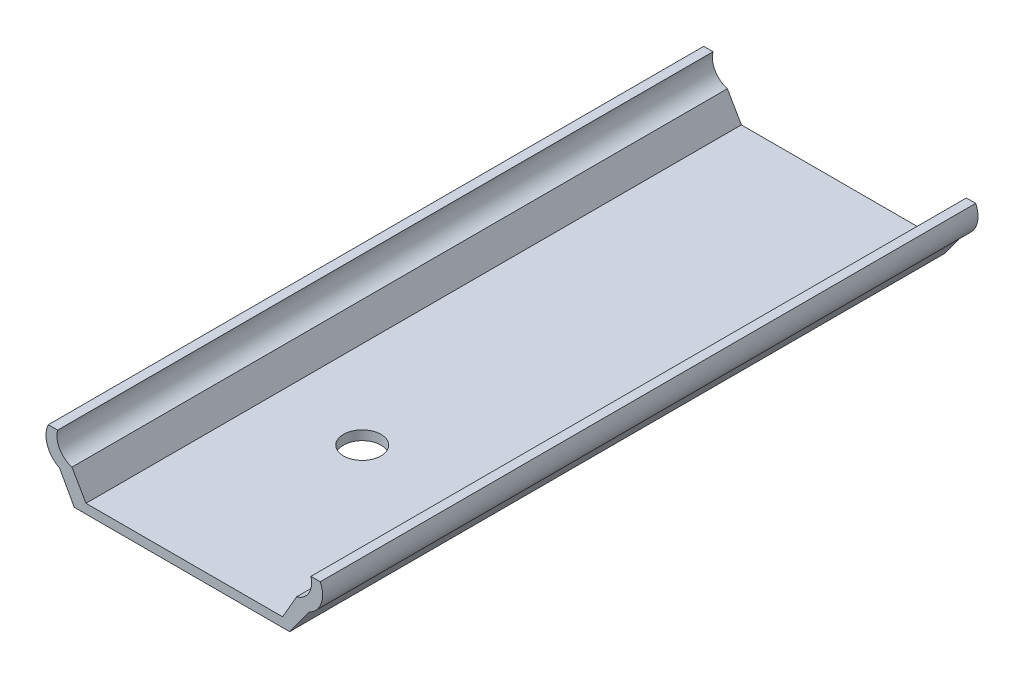
ISO-10303-21;
HEADER;
FILE_DESCRIPTION(('STEP AP214'),'2;1');
FILE_NAME('part.step','',(''),(''),'','','');
FILE_SCHEMA(('AUTOMOTIVE_DESIGN { 1 0 10303 214 1 1 1 1 }'));
ENDSEC;
DATA;
#1=APPLICATION_CONTEXT('core data for automotive mechanical design processes');
#2=APPLICATION_PROTOCOL_DEFINITION('international standard','automotive_design',2000,#1);
#3=PRODUCT_CONTEXT('',#1,'mechanical');
#4=PRODUCT('Part','Part','',(#3));
#5=PRODUCT_RELATED_PRODUCT_CATEGORY('part','',(#4));
#6=PRODUCT_DEFINITION_FORMATION('','',#4);
#7=PRODUCT_DEFINITION_CONTEXT('part definition',#1,'design');
#8=PRODUCT_DEFINITION('design','',#6,#7);
#9=PRODUCT_DEFINITION_SHAPE('','',#8);
#10=(LENGTH_UNIT() NAMED_UNIT(*) SI_UNIT(.MILLI.,.METRE.));
#11=(NAMED_UNIT(*) PLANE_ANGLE_UNIT() SI_UNIT($,.RADIAN.));
#12=(NAMED_UNIT(*) SI_UNIT($,.STERADIAN.) SOLID_ANGLE_UNIT());
#13=UNCERTAINTY_MEASURE_WITH_UNIT(LENGTH_MEASURE(1.E-05),#10,'distance_accuracy_value','');
#14=(GEOMETRIC_REPRESENTATION_CONTEXT(3) GLOBAL_UNCERTAINTY_ASSIGNED_CONTEXT((#13)) GLOBAL_UNIT_ASSIGNED_CONTEXT((#10,
#11,#12)) REPRESENTATION_CONTEXT('',''));
#15=CARTESIAN_POINT('',(0.,0.,0.));
#16=DIRECTION('',(0.,0.,1.));
#17=DIRECTION('',(1.,0.,0.));
#18=AXIS2_PLACEMENT_3D('',#15,#16,#17);
#19=CARTESIAN_POINT('',(10.5,0.,70.));
#20=DIRECTION('',(0.866767982268974,-0.498711604951572,0.));
#21=DIRECTION('',(0.498711604951572,0.866767982268974,0.));
#22=AXIS2_PLACEMENT_3D('',#19,#20,#21);
#23=PLANE('',#22);
#24=DIRECTION('',(-0.498711604951572,-0.866767982268974,0.));
#25=VECTOR('',#24,1.);
#26=CARTESIAN_POINT('',(10.5,0.,0.));
#27=LINE('',#26,#25);
#28=CARTESIAN_POINT('',(11.9961348148547,2.60030394680692,0.));
#29=VERTEX_POINT('',#28);
#30=CARTESIAN_POINT('',(10.5,0.,0.));
#31=VERTEX_POINT('',#30);
#32=EDGE_CURVE('E153',#29,#31,#27,.T.);
#33=ORIENTED_EDGE('',*,*,#32,.T.);
#34=DIRECTION('',(0.,0.,-1.));
#35=VECTOR('',#34,1.);
#36=CARTESIAN_POINT('',(10.5,0.,70.));
#37=LINE('',#36,#35);
#38=CARTESIAN_POINT('',(10.5,0.,70.));
#39=VERTEX_POINT('',#38);
#40=EDGE_CURVE('E11',#39,#31,#37,.T.);
#41=ORIENTED_EDGE('',*,*,#40,.F.);
#42=DIRECTION('',(-0.498711604951572,-0.866767982268974,0.));
#43=VECTOR('',#42,1.);
#44=CARTESIAN_POINT('',(10.5,0.,70.));
#45=LINE('',#44,#43);
#46=CARTESIAN_POINT('',(11.9961348148547,2.60030394680692,70.));
#47=VERTEX_POINT('',#46);
#48=EDGE_CURVE('E176',#47,#39,#45,.T.);
#49=ORIENTED_EDGE('',*,*,#48,.F.);
#50=DIRECTION('',(0.,0.,-1.));
#51=VECTOR('',#50,1.);
#52=CARTESIAN_POINT('',(11.9961348148547,2.60030394680692,70.));
#53=LINE('',#52,#51);
#54=EDGE_CURVE('E149',#47,#29,#53,.T.);
#55=ORIENTED_EDGE('',*,*,#54,.T.);
#56=EDGE_LOOP('',(#33,#41,#49,#55));
#57=FACE_BOUND('',#56,.T.);
#58=ADVANCED_FACE('F33',(#57),#23,.F.);
#59=CARTESIAN_POINT('',(-10.5,0.,70.));
#60=DIRECTION('',(0.,-1.,0.));
#61=DIRECTION('',(0.,0.,-1.));
#62=AXIS2_PLACEMENT_3D('',#59,#60,#61);
#63=PLANE('',#62);
#64=CARTESIAN_POINT('',(-1.13037735626936,0.,49.8683720787986));
#65=DIRECTION('',(0.,-1.,0.));
#66=DIRECTION('',(0.,0.,-1.));
#67=AXIS2_PLACEMENT_3D('',#64,#65,#66);
#68=CIRCLE('',#67,2.);
#69=CARTESIAN_POINT('',(-1.13037735626936,0.,47.8683720787986));
#70=VERTEX_POINT('',#69);
#71=EDGE_CURVE('E157',#70,#70,#68,.T.);
#72=ORIENTED_EDGE('',*,*,#71,.T.);
#73=EDGE_LOOP('',(#72));
#74=FACE_BOUND('',#73,.T.);
#75=DIRECTION('',(-1.,0.,0.));
#76=VECTOR('',#75,1.);
#77=CARTESIAN_POINT('',(-10.5,0.,0.));
#78=LINE('',#77,#76);
#79=CARTESIAN_POINT('',(-10.5,0.,0.));
#80=VERTEX_POINT('',#79);
#81=EDGE_CURVE('E156',#31,#80,#78,.T.);
#82=ORIENTED_EDGE('',*,*,#81,.T.);
#83=DIRECTION('',(0.,0.,-1.));
#84=VECTOR('',#83,1.);
#85=CARTESIAN_POINT('',(-10.5,0.,70.));
#86=LINE('',#85,#84);
#87=CARTESIAN_POINT('',(-10.5,0.,70.));
#88=VERTEX_POINT('',#87);
#89=EDGE_CURVE('E41',#88,#80,#86,.T.);
#90=ORIENTED_EDGE('',*,*,#89,.F.);
#91=DIRECTION('',(-1.,0.,0.));
#92=VECTOR('',#91,1.);
#93=CARTESIAN_POINT('',(-10.5,0.,70.));
#94=LINE('',#93,#92);
#95=EDGE_CURVE('E104',#39,#88,#94,.T.);
#96=ORIENTED_EDGE('',*,*,#95,.F.);
#97=ORIENTED_EDGE('',*,*,#40,.T.);
#98=EDGE_LOOP('',(#82,#90,#96,#97));
#99=FACE_BOUND('',#98,.T.);
#100=ADVANCED_FACE('F254',(#74,#99),#63,.F.);
#101=CARTESIAN_POINT('',(-10.5,0.,70.));
#102=DIRECTION('',(-0.866767982268973,-0.498711604951573,0.));
#103=DIRECTION('',(0.498711604951573,-0.866767982268973,0.));
#104=AXIS2_PLACEMENT_3D('',#101,#102,#103);
#105=PLANE('',#104);
#106=DIRECTION('',(-0.498711604951573,0.866767982268972,0.));
#107=VECTOR('',#106,1.);
#108=CARTESIAN_POINT('',(-10.5,0.,0.));
#109=LINE('',#108,#107);
#110=CARTESIAN_POINT('',(-11.9961348148547,2.60030394680692,0.));
#111=VERTEX_POINT('',#110);
#112=EDGE_CURVE('E159',#80,#111,#109,.T.);
#113=ORIENTED_EDGE('',*,*,#112,.T.);
#114=DIRECTION('',(0.,0.,-1.));
#115=VECTOR('',#114,1.);
#116=CARTESIAN_POINT('',(-11.9961348148547,2.60030394680692,70.));
#117=LINE('',#116,#115);
#118=CARTESIAN_POINT('',(-11.9961348148547,2.60030394680692,70.));
#119=VERTEX_POINT('',#118);
#120=EDGE_CURVE('E195',#119,#111,#117,.T.);
#121=ORIENTED_EDGE('',*,*,#120,.F.);
#122=DIRECTION('',(-0.498711604951573,0.866767982268972,0.));
#123=VECTOR('',#122,1.);
#124=CARTESIAN_POINT('',(-10.5,0.,70.));
#125=LINE('',#124,#123);
#126=EDGE_CURVE('E203',#88,#119,#125,.T.);
#127=ORIENTED_EDGE('',*,*,#126,.F.);
#128=ORIENTED_EDGE('',*,*,#89,.T.);
#129=EDGE_LOOP('',(#113,#121,#127,#128));
#130=FACE_BOUND('',#129,.T.);
#131=ADVANCED_FACE('F201',(#130),#105,.F.);
#132=CARTESIAN_POINT('',(-11.4321180718337,4.69279139413521,70.));
#133=DIRECTION('',(0.,0.,-1.));
#134=DIRECTION('',(-1.,0.,0.));
#135=AXIS2_PLACEMENT_3D('',#132,#133,#134);
#136=CYLINDRICAL_SURFACE('',#135,2.16716833763196);
#137=CARTESIAN_POINT('',(-11.4321180718337,4.69279139413521,0.));
#138=DIRECTION('',(0.,0.,-1.));
#139=DIRECTION('',(-1.,0.,0.));
#140=AXIS2_PLACEMENT_3D('',#137,#138,#139);
#141=CIRCLE('',#140,2.16716833763196);
#142=CARTESIAN_POINT('',(-13.524605519162,5.25680813715619,0.));
#143=VERTEX_POINT('',#142);
#144=EDGE_CURVE('E161',#111,#143,#141,.T.);
#145=ORIENTED_EDGE('',*,*,#144,.T.);
#146=DIRECTION('',(0.,0.,-1.));
#147=VECTOR('',#146,1.);
#148=CARTESIAN_POINT('',(-13.524605519162,5.25680813715619,70.));
#149=LINE('',#148,#147);
#150=CARTESIAN_POINT('',(-13.524605519162,5.25680813715619,70.));
#151=VERTEX_POINT('',#150);
#152=EDGE_CURVE('E192',#151,#143,#149,.T.);
#153=ORIENTED_EDGE('',*,*,#152,.F.);
#154=CARTESIAN_POINT('',(-11.4321180718337,4.69279139413521,70.));
#155=DIRECTION('',(0.,0.,-1.));
#156=DIRECTION('',(-1.,0.,0.));
#157=AXIS2_PLACEMENT_3D('',#154,#155,#156);
#158=CIRCLE('',#157,2.16716833763196);
#159=EDGE_CURVE('E221',#119,#151,#158,.T.);
#160=ORIENTED_EDGE('',*,*,#159,.F.);
#161=ORIENTED_EDGE('',*,*,#120,.T.);
#162=EDGE_LOOP('',(#145,#153,#160,#161));
#163=FACE_BOUND('',#162,.T.);
#164=ADVANCED_FACE('F212',(#163),#136,.F.);
#165=CARTESIAN_POINT('',(-13.524605519162,5.25680813715619,70.));
#166=DIRECTION('',(0.,-1.,0.));
#167=DIRECTION('',(0.,0.,-1.));
#168=AXIS2_PLACEMENT_3D('',#165,#166,#167);
#169=PLANE('',#168);
#170=DIRECTION('',(-1.,0.,0.));
#171=VECTOR('',#170,1.);
#172=CARTESIAN_POINT('',(-13.524605519162,5.25680813715619,0.));
#173=LINE('',#172,#171);
#174=CARTESIAN_POINT('',(-14.524605519162,5.25680813715619,0.));
#175=VERTEX_POINT('',#174);
#176=EDGE_CURVE('E163',#143,#175,#173,.T.);
#177=ORIENTED_EDGE('',*,*,#176,.T.);
#178=DIRECTION('',(0.,0.,-1.));
#179=VECTOR('',#178,1.);
#180=CARTESIAN_POINT('',(-14.524605519162,5.25680813715619,70.));
#181=LINE('',#180,#179);
#182=CARTESIAN_POINT('',(-14.524605519162,5.25680813715619,70.));
#183=VERTEX_POINT('',#182);
#184=EDGE_CURVE('E189',#183,#175,#181,.T.);
#185=ORIENTED_EDGE('',*,*,#184,.F.);
#186=DIRECTION('',(-1.,0.,0.));
#187=VECTOR('',#186,1.);
#188=CARTESIAN_POINT('',(-13.524605519162,5.25680813715619,70.));
#189=LINE('',#188,#187);
#190=EDGE_CURVE('E218',#151,#183,#189,.T.);
#191=ORIENTED_EDGE('',*,*,#190,.F.);
#192=ORIENTED_EDGE('',*,*,#152,.T.);
#193=EDGE_LOOP('',(#177,#185,#191,#192));
#194=FACE_BOUND('',#193,.T.);
#195=ADVANCED_FACE('F216',(#194),#169,.F.);
#196=CARTESIAN_POINT('',(-12.2111886965595,4.15744663463556,70.));
#197=DIRECTION('',(0.,0.,-1.));
#198=DIRECTION('',(-1.,0.,0.));
#199=AXIS2_PLACEMENT_3D('',#196,#197,#198);
#200=CYLINDRICAL_SURFACE('',#199,2.56134595639178);
#201=CARTESIAN_POINT('',(-12.2111886965595,4.15744663463556,0.));
#202=DIRECTION('',(0.,0.,1.));
#203=DIRECTION('',(1.,0.,0.));
#204=AXIS2_PLACEMENT_3D('',#201,#202,#203);
#205=CIRCLE('',#204,2.56134595639178);
#206=CARTESIAN_POINT('',(-13.3105501990802,1.8440298120331,0.));
#207=VERTEX_POINT('',#206);
#208=EDGE_CURVE('E165',#175,#207,#205,.T.);
#209=ORIENTED_EDGE('',*,*,#208,.T.);
#210=DIRECTION('',(0.,0.,-1.));
#211=VECTOR('',#210,1.);
#212=CARTESIAN_POINT('',(-13.3105501990802,1.8440298120331,70.));
#213=LINE('',#212,#211);
#214=CARTESIAN_POINT('',(-13.3105501990802,1.8440298120331,70.));
#215=VERTEX_POINT('',#214);
#216=EDGE_CURVE('E186',#215,#207,#213,.T.);
#217=ORIENTED_EDGE('',*,*,#216,.F.);
#218=CARTESIAN_POINT('',(-12.2111886965595,4.15744663463556,70.));
#219=DIRECTION('',(0.,0.,1.));
#220=DIRECTION('',(1.,0.,0.));
#221=AXIS2_PLACEMENT_3D('',#218,#219,#220);
#222=CIRCLE('',#221,2.56134595639178);
#223=EDGE_CURVE('E220',#183,#215,#222,.T.);
#224=ORIENTED_EDGE('',*,*,#223,.F.);
#225=ORIENTED_EDGE('',*,*,#184,.T.);
#226=EDGE_LOOP('',(#209,#217,#224,#225));
#227=FACE_BOUND('',#226,.T.);
#228=ADVANCED_FACE('F269',(#227),#200,.T.);
#229=CARTESIAN_POINT('',(-13.3105501990802,1.8440298120331,70.));
#230=DIRECTION('',(0.876707863362569,0.481023203513343,0.));
#231=DIRECTION('',(-0.481023203513343,0.876707863362569,0.));
#232=AXIS2_PLACEMENT_3D('',#229,#230,#231);
#233=PLANE('',#232);
#234=DIRECTION('',(0.481023203513342,-0.876707863362569,0.));
#235=VECTOR('',#234,1.);
#236=CARTESIAN_POINT('',(-13.3105501990802,1.8440298120331,0.));
#237=LINE('',#236,#235);
#238=CARTESIAN_POINT('',(-11.7501166861144,-0.999999999999996,0.));
#239=VERTEX_POINT('',#238);
#240=EDGE_CURVE('E167',#207,#239,#237,.T.);
#241=ORIENTED_EDGE('',*,*,#240,.T.);
#242=DIRECTION('',(0.,0.,-1.));
#243=VECTOR('',#242,1.);
#244=CARTESIAN_POINT('',(-11.7501166861144,-0.999999999999996,70.));
#245=LINE('',#244,#243);
#246=CARTESIAN_POINT('',(-11.7501166861144,-0.999999999999996,70.));
#247=VERTEX_POINT('',#246);
#248=EDGE_CURVE('E183',#247,#239,#245,.T.);
#249=ORIENTED_EDGE('',*,*,#248,.F.);
#250=DIRECTION('',(0.481023203513342,-0.876707863362569,0.));
#251=VECTOR('',#250,1.);
#252=CARTESIAN_POINT('',(-13.3105501990802,1.8440298120331,70.));
#253=LINE('',#252,#251);
#254=EDGE_CURVE('E223',#215,#247,#253,.T.);
#255=ORIENTED_EDGE('',*,*,#254,.F.);
#256=ORIENTED_EDGE('',*,*,#216,.T.);
#257=EDGE_LOOP('',(#241,#249,#255,#256));
#258=FACE_BOUND('',#257,.T.);
#259=ADVANCED_FACE('F272',(#258),#233,.F.);
#260=CARTESIAN_POINT('',(-11.7501166861144,-0.999999999999996,70.));
#261=DIRECTION('',(0.,1.,0.));
#262=DIRECTION('',(0.,0.,1.));
#263=AXIS2_PLACEMENT_3D('',#260,#261,#262);
#264=PLANE('',#263);
#265=CARTESIAN_POINT('',(-1.13037735626936,-0.999999999999996,49.8683720787986));
#266=DIRECTION('',(0.,-1.,0.));
#267=DIRECTION('',(0.,0.,-1.));
#268=AXIS2_PLACEMENT_3D('',#265,#266,#267);
#269=CIRCLE('',#268,2.);
#270=CARTESIAN_POINT('',(-1.13037735626936,-0.999999999999996,47.8683720787986));
#271=VERTEX_POINT('',#270);
#272=EDGE_CURVE('E339',#271,#271,#269,.T.);
#273=ORIENTED_EDGE('',*,*,#272,.F.);
#274=EDGE_LOOP('',(#273));
#275=FACE_BOUND('',#274,.T.);
#276=DIRECTION('',(1.,0.,0.));
#277=VECTOR('',#276,1.);
#278=CARTESIAN_POINT('',(-11.7501166861144,-0.999999999999996,0.));
#279=LINE('',#278,#277);
#280=CARTESIAN_POINT('',(11.2498833138856,-0.999999999999996,0.));
#281=VERTEX_POINT('',#280);
#282=EDGE_CURVE('E169',#239,#281,#279,.T.);
#283=ORIENTED_EDGE('',*,*,#282,.T.);
#284=DIRECTION('',(0.,0.,-1.));
#285=VECTOR('',#284,1.);
#286=CARTESIAN_POINT('',(11.2498833138856,-0.999999999999996,70.));
#287=LINE('',#286,#285);
#288=CARTESIAN_POINT('',(11.2498833138856,-0.999999999999996,70.));
#289=VERTEX_POINT('',#288);
#290=EDGE_CURVE('E180',#289,#281,#287,.T.);
#291=ORIENTED_EDGE('',*,*,#290,.F.);
#292=DIRECTION('',(1.,0.,0.));
#293=VECTOR('',#292,1.);
#294=CARTESIAN_POINT('',(-11.7501166861144,-0.999999999999996,70.));
#295=LINE('',#294,#293);
#296=EDGE_CURVE('E229',#247,#289,#295,.T.);
#297=ORIENTED_EDGE('',*,*,#296,.F.);
#298=ORIENTED_EDGE('',*,*,#248,.T.);
#299=EDGE_LOOP('',(#283,#291,#297,#298));
#300=FACE_BOUND('',#299,.T.);
#301=ADVANCED_FACE('F235',(#275,#300),#264,.F.);
#302=CARTESIAN_POINT('',(11.2498833138856,-0.999999999999996,70.));
#303=DIRECTION('',(-0.809780184232938,0.586733374901811,0.));
#304=DIRECTION('',(-0.586733374901811,-0.809780184232938,0.));
#305=AXIS2_PLACEMENT_3D('',#302,#303,#304);
#306=PLANE('',#305);
#307=DIRECTION('',(0.586733374901811,0.809780184232938,0.));
#308=VECTOR('',#307,1.);
#309=CARTESIAN_POINT('',(11.2498833138856,-0.999999999999996,0.));
#310=LINE('',#309,#308);
#311=CARTESIAN_POINT('',(13.3105501990802,1.8440298120331,0.));
#312=VERTEX_POINT('',#311);
#313=EDGE_CURVE('E171',#281,#312,#310,.T.);
#314=ORIENTED_EDGE('',*,*,#313,.T.);
#315=DIRECTION('',(0.,0.,-1.));
#316=VECTOR('',#315,1.);
#317=CARTESIAN_POINT('',(13.3105501990802,1.8440298120331,70.));
#318=LINE('',#317,#316);
#319=CARTESIAN_POINT('',(13.3105501990802,1.8440298120331,70.));
#320=VERTEX_POINT('',#319);
#321=EDGE_CURVE('E144',#320,#312,#318,.T.);
#322=ORIENTED_EDGE('',*,*,#321,.F.);
#323=DIRECTION('',(0.586733374901811,0.809780184232938,0.));
#324=VECTOR('',#323,1.);
#325=CARTESIAN_POINT('',(11.2498833138856,-0.999999999999996,70.));
#326=LINE('',#325,#324);
#327=EDGE_CURVE('E135',#289,#320,#326,.T.);
#328=ORIENTED_EDGE('',*,*,#327,.F.);
#329=ORIENTED_EDGE('',*,*,#290,.T.);
#330=EDGE_LOOP('',(#314,#322,#328,#329));
#331=FACE_BOUND('',#330,.T.);
#332=ADVANCED_FACE('F239',(#331),#306,.F.);
#333=CARTESIAN_POINT('',(12.2111886965595,4.15744663463556,70.));
#334=DIRECTION('',(0.,0.,-1.));
#335=DIRECTION('',(-1.,0.,0.));
#336=AXIS2_PLACEMENT_3D('',#333,#334,#335);
#337=CYLINDRICAL_SURFACE('',#336,2.56134595639178);
#338=CARTESIAN_POINT('',(12.2111886965595,4.15744663463556,0.));
#339=DIRECTION('',(0.,0.,1.));
#340=DIRECTION('',(-1.,0.,0.));
#341=AXIS2_PLACEMENT_3D('',#338,#339,#340);
#342=CIRCLE('',#341,2.56134595639178);
#343=CARTESIAN_POINT('',(14.524605519162,5.25680813715619,0.));
#344=VERTEX_POINT('',#343);
#345=EDGE_CURVE('E143',#312,#344,#342,.T.);
#346=ORIENTED_EDGE('',*,*,#345,.T.);
#347=DIRECTION('',(0.,0.,-1.));
#348=VECTOR('',#347,1.);
#349=CARTESIAN_POINT('',(14.524605519162,5.25680813715619,70.));
#350=LINE('',#349,#348);
#351=CARTESIAN_POINT('',(14.524605519162,5.25680813715619,70.));
#352=VERTEX_POINT('',#351);
#353=EDGE_CURVE('E140',#352,#344,#350,.T.);
#354=ORIENTED_EDGE('',*,*,#353,.F.);
#355=CARTESIAN_POINT('',(12.2111886965595,4.15744663463556,70.));
#356=DIRECTION('',(0.,0.,1.));
#357=DIRECTION('',(-1.,0.,0.));
#358=AXIS2_PLACEMENT_3D('',#355,#356,#357);
#359=CIRCLE('',#358,2.56134595639178);
#360=EDGE_CURVE('E129',#320,#352,#359,.T.);
#361=ORIENTED_EDGE('',*,*,#360,.F.);
#362=ORIENTED_EDGE('',*,*,#321,.T.);
#363=EDGE_LOOP('',(#346,#354,#361,#362));
#364=FACE_BOUND('',#363,.T.);
#365=ADVANCED_FACE('F141',(#364),#337,.T.);
#366=CARTESIAN_POINT('',(13.524605519162,5.25680813715619,70.));
#367=DIRECTION('',(0.,-1.,0.));
#368=DIRECTION('',(0.,0.,-1.));
#369=AXIS2_PLACEMENT_3D('',#366,#367,#368);
#370=PLANE('',#369);
#371=DIRECTION('',(-1.,0.,0.));
#372=VECTOR('',#371,1.);
#373=CARTESIAN_POINT('',(13.524605519162,5.25680813715619,0.));
#374=LINE('',#373,#372);
#375=CARTESIAN_POINT('',(13.524605519162,5.25680813715619,0.));
#376=VERTEX_POINT('',#375);
#377=EDGE_CURVE('E90',#344,#376,#374,.T.);
#378=ORIENTED_EDGE('',*,*,#377,.T.);
#379=DIRECTION('',(0.,0.,-1.));
#380=VECTOR('',#379,1.);
#381=CARTESIAN_POINT('',(13.524605519162,5.25680813715619,70.));
#382=LINE('',#381,#380);
#383=CARTESIAN_POINT('',(13.524605519162,5.25680813715619,70.));
#384=VERTEX_POINT('',#383);
#385=EDGE_CURVE('E145',#384,#376,#382,.T.);
#386=ORIENTED_EDGE('',*,*,#385,.F.);
#387=DIRECTION('',(-1.,0.,0.));
#388=VECTOR('',#387,1.);
#389=CARTESIAN_POINT('',(13.524605519162,5.25680813715619,70.));
#390=LINE('',#389,#388);
#391=EDGE_CURVE('E133',#352,#384,#390,.T.);
#392=ORIENTED_EDGE('',*,*,#391,.F.);
#393=ORIENTED_EDGE('',*,*,#353,.T.);
#394=EDGE_LOOP('',(#378,#386,#392,#393));
#395=FACE_BOUND('',#394,.T.);
#396=ADVANCED_FACE('F147',(#395),#370,.F.);
#397=CARTESIAN_POINT('',(11.4321180718337,4.69279139413521,70.));
#398=DIRECTION('',(0.,0.,-1.));
#399=DIRECTION('',(-1.,0.,0.));
#400=AXIS2_PLACEMENT_3D('',#397,#398,#399);
#401=CYLINDRICAL_SURFACE('',#400,2.16716833763196);
#402=CARTESIAN_POINT('',(11.4321180718337,4.69279139413521,0.));
#403=DIRECTION('',(0.,0.,-1.));
#404=DIRECTION('',(1.,0.,0.));
#405=AXIS2_PLACEMENT_3D('',#402,#403,#404);
#406=CIRCLE('',#405,2.16716833763196);
#407=EDGE_CURVE('E96',#376,#29,#406,.T.);
#408=ORIENTED_EDGE('',*,*,#407,.T.);
#409=ORIENTED_EDGE('',*,*,#54,.F.);
#410=CARTESIAN_POINT('',(11.4321180718337,4.69279139413521,70.));
#411=DIRECTION('',(0.,0.,-1.));
#412=DIRECTION('',(1.,0.,0.));
#413=AXIS2_PLACEMENT_3D('',#410,#411,#412);
#414=CIRCLE('',#413,2.16716833763196);
#415=EDGE_CURVE('E49',#384,#47,#414,.T.);
#416=ORIENTED_EDGE('',*,*,#415,.F.);
#417=ORIENTED_EDGE('',*,*,#385,.T.);
#418=EDGE_LOOP('',(#408,#409,#416,#417));
#419=FACE_BOUND('',#418,.T.);
#420=ADVANCED_FACE('F243',(#419),#401,.F.);
#421=CARTESIAN_POINT('',(11.4321180718337,4.69279139413521,70.));
#422=DIRECTION('',(0.,0.,1.));
#423=DIRECTION('',(1.,0.,0.));
#424=AXIS2_PLACEMENT_3D('',#421,#422,#423);
#425=PLANE('',#424);
#426=ORIENTED_EDGE('',*,*,#48,.T.);
#427=ORIENTED_EDGE('',*,*,#95,.T.);
#428=ORIENTED_EDGE('',*,*,#126,.T.);
#429=ORIENTED_EDGE('',*,*,#159,.T.);
#430=ORIENTED_EDGE('',*,*,#190,.T.);
#431=ORIENTED_EDGE('',*,*,#223,.T.);
#432=ORIENTED_EDGE('',*,*,#254,.T.);
#433=ORIENTED_EDGE('',*,*,#296,.T.);
#434=ORIENTED_EDGE('',*,*,#327,.T.);
#435=ORIENTED_EDGE('',*,*,#360,.T.);
#436=ORIENTED_EDGE('',*,*,#391,.T.);
#437=ORIENTED_EDGE('',*,*,#415,.T.);
#438=EDGE_LOOP('',(#426,#427,#428,#429,#430,#431,#432,#433,#434,#435,#436,#437));
#439=FACE_BOUND('',#438,.T.);
#440=ADVANCED_FACE('F131',(#439),#425,.T.);
#441=CARTESIAN_POINT('',(11.4321180718337,4.69279139413521,0.));
#442=DIRECTION('',(0.,0.,1.));
#443=DIRECTION('',(1.,0.,0.));
#444=AXIS2_PLACEMENT_3D('',#441,#442,#443);
#445=PLANE('',#444);
#446=ORIENTED_EDGE('',*,*,#32,.F.);
#447=ORIENTED_EDGE('',*,*,#407,.F.);
#448=ORIENTED_EDGE('',*,*,#377,.F.);
#449=ORIENTED_EDGE('',*,*,#345,.F.);
#450=ORIENTED_EDGE('',*,*,#313,.F.);
#451=ORIENTED_EDGE('',*,*,#282,.F.);
#452=ORIENTED_EDGE('',*,*,#240,.F.);
#453=ORIENTED_EDGE('',*,*,#208,.F.);
#454=ORIENTED_EDGE('',*,*,#176,.F.);
#455=ORIENTED_EDGE('',*,*,#144,.F.);
#456=ORIENTED_EDGE('',*,*,#112,.F.);
#457=ORIENTED_EDGE('',*,*,#81,.F.);
#458=EDGE_LOOP('',(#446,#447,#448,#449,#450,#451,#452,#453,#454,#455,#456,#457));
#459=FACE_BOUND('',#458,.T.);
#460=ADVANCED_FACE('F207',(#459),#445,.F.);
#461=CARTESIAN_POINT('',(-1.13037735626936,9.00000000000001,49.8683720787986));
#462=DIRECTION('',(0.,-1.,0.));
#463=DIRECTION('',(0.,0.,-1.));
#464=AXIS2_PLACEMENT_3D('',#461,#462,#463);
#465=CYLINDRICAL_SURFACE('',#464,2.);
#466=ORIENTED_EDGE('',*,*,#272,.T.);
#467=EDGE_LOOP('',(#466));
#468=FACE_BOUND('',#467,.T.);
#469=ORIENTED_EDGE('',*,*,#71,.F.);
#470=EDGE_LOOP('',(#469));
#471=FACE_BOUND('',#470,.T.);
#472=ADVANCED_FACE('F309',(#468,#471),#465,.F.);
#473=CLOSED_SHELL('',(#58,#100,#131,#164,#195,#228,#259,#301,#332,#365,#396,#420,#440,#460,#472));
#474=MANIFOLD_SOLID_BREP('B2',#473);
#475=ADVANCED_BREP_SHAPE_REPRESENTATION('',(#18,#474),#14);
#476=SHAPE_DEFINITION_REPRESENTATION(#9,#475);
ENDSEC;
END-ISO-10303-21;
